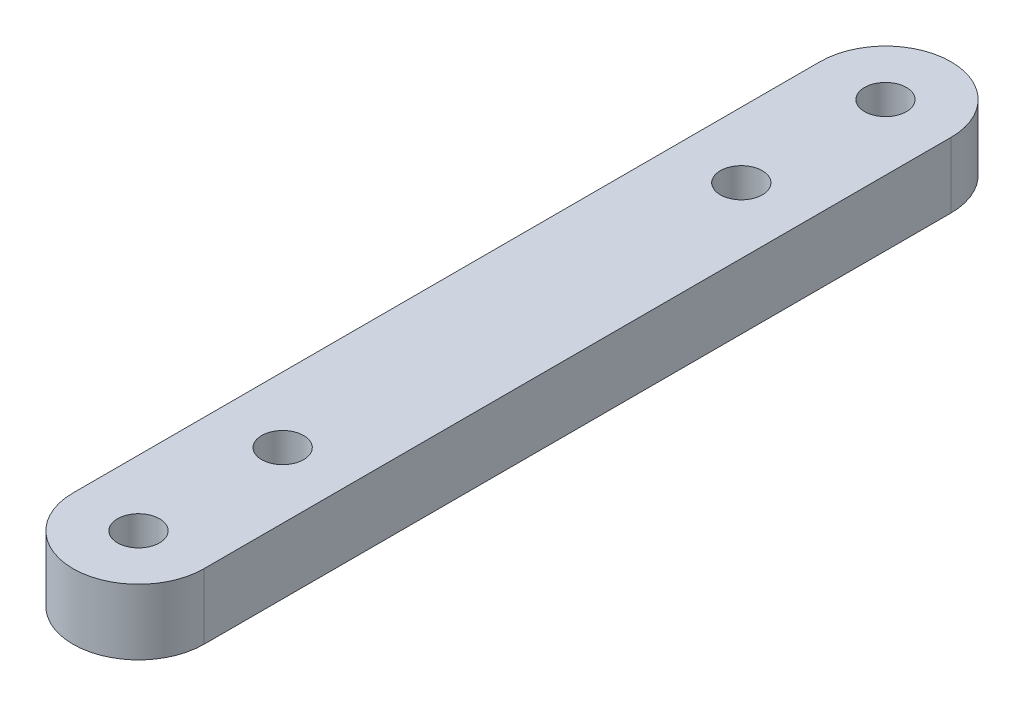
ISO-10303-21;
HEADER;
FILE_DESCRIPTION(('STEP AP214'),'2;1');
FILE_NAME('part.step','',(''),(''),'','','');
FILE_SCHEMA(('AUTOMOTIVE_DESIGN { 1 0 10303 214 1 1 1 1 }'));
ENDSEC;
DATA;
#1=APPLICATION_CONTEXT('core data for automotive mechanical design processes');
#2=APPLICATION_PROTOCOL_DEFINITION('international standard','automotive_design',2000,#1);
#3=PRODUCT_CONTEXT('',#1,'mechanical');
#4=PRODUCT('Part','Part','',(#3));
#5=PRODUCT_RELATED_PRODUCT_CATEGORY('part','',(#4));
#6=PRODUCT_DEFINITION_FORMATION('','',#4);
#7=PRODUCT_DEFINITION_CONTEXT('part definition',#1,'design');
#8=PRODUCT_DEFINITION('design','',#6,#7);
#9=PRODUCT_DEFINITION_SHAPE('','',#8);
#10=(LENGTH_UNIT() NAMED_UNIT(*) SI_UNIT(.MILLI.,.METRE.));
#11=(NAMED_UNIT(*) PLANE_ANGLE_UNIT() SI_UNIT($,.RADIAN.));
#12=(NAMED_UNIT(*) SI_UNIT($,.STERADIAN.) SOLID_ANGLE_UNIT());
#13=UNCERTAINTY_MEASURE_WITH_UNIT(LENGTH_MEASURE(1.E-05),#10,'distance_accuracy_value','');
#14=(GEOMETRIC_REPRESENTATION_CONTEXT(3) GLOBAL_UNCERTAINTY_ASSIGNED_CONTEXT((#13)) GLOBAL_UNIT_ASSIGNED_CONTEXT((#10,
#11,#12)) REPRESENTATION_CONTEXT('',''));
#15=CARTESIAN_POINT('',(0.,0.,0.));
#16=DIRECTION('',(0.,0.,1.));
#17=DIRECTION('',(1.,0.,0.));
#18=AXIS2_PLACEMENT_3D('',#15,#16,#17);
#19=CARTESIAN_POINT('',(1.00000000000001,5.,-17.5));
#20=DIRECTION('',(0.,-1.,0.));
#21=DIRECTION('',(0.,0.,-1.));
#22=AXIS2_PLACEMENT_3D('',#19,#20,#21);
#23=CYLINDRICAL_SURFACE('',#22,1.6);
#24=CARTESIAN_POINT('',(1.00000000000001,5.,-17.5));
#25=DIRECTION('',(0.,1.,0.));
#26=DIRECTION('',(0.,0.,1.));
#27=AXIS2_PLACEMENT_3D('',#24,#25,#26);
#28=CIRCLE('',#27,1.6);
#29=CARTESIAN_POINT('',(1.00000000000001,5.,-15.9));
#30=VERTEX_POINT('',#29);
#31=EDGE_CURVE('E133',#30,#30,#28,.T.);
#32=ORIENTED_EDGE('',*,*,#31,.T.);
#33=EDGE_LOOP('',(#32));
#34=FACE_BOUND('',#33,.T.);
#35=CARTESIAN_POINT('',(1.00000000000001,2.5,-17.5));
#36=DIRECTION('',(0.,-1.,0.));
#37=DIRECTION('',(0.,0.,-1.));
#38=AXIS2_PLACEMENT_3D('',#35,#36,#37);
#39=CIRCLE('',#38,1.6);
#40=CARTESIAN_POINT('',(1.00000000000001,2.5,-19.1));
#41=VERTEX_POINT('',#40);
#42=EDGE_CURVE('E36',#41,#41,#39,.T.);
#43=ORIENTED_EDGE('',*,*,#42,.T.);
#44=EDGE_LOOP('',(#43));
#45=FACE_BOUND('',#44,.T.);
#46=ADVANCED_FACE('F32',(#34,#45),#23,.F.);
#47=CARTESIAN_POINT('',(1.00000000000001,5.,17.5));
#48=DIRECTION('',(0.,-1.,0.));
#49=DIRECTION('',(0.,0.,-1.));
#50=AXIS2_PLACEMENT_3D('',#47,#48,#49);
#51=CYLINDRICAL_SURFACE('',#50,1.6);
#52=CARTESIAN_POINT('',(1.00000000000001,5.,17.5));
#53=DIRECTION('',(0.,1.,0.));
#54=DIRECTION('',(0.,0.,-1.));
#55=AXIS2_PLACEMENT_3D('',#52,#53,#54);
#56=CIRCLE('',#55,1.6);
#57=CARTESIAN_POINT('',(1.00000000000001,5.,15.9));
#58=VERTEX_POINT('',#57);
#59=EDGE_CURVE('E129',#58,#58,#56,.T.);
#60=ORIENTED_EDGE('',*,*,#59,.T.);
#61=EDGE_LOOP('',(#60));
#62=FACE_BOUND('',#61,.T.);
#63=CARTESIAN_POINT('',(1.00000000000001,2.5,17.5));
#64=DIRECTION('',(0.,-1.,0.));
#65=DIRECTION('',(0.,0.,-1.));
#66=AXIS2_PLACEMENT_3D('',#63,#64,#65);
#67=CIRCLE('',#66,1.6);
#68=CARTESIAN_POINT('',(1.00000000000001,2.5,15.9));
#69=VERTEX_POINT('',#68);
#70=EDGE_CURVE('E108',#69,#69,#67,.T.);
#71=ORIENTED_EDGE('',*,*,#70,.T.);
#72=EDGE_LOOP('',(#71));
#73=FACE_BOUND('',#72,.T.);
#74=ADVANCED_FACE('F162',(#62,#73),#51,.F.);
#75=CARTESIAN_POINT('',(1.00000000000001,5.,-28.5));
#76=DIRECTION('',(0.,1.,0.));
#77=DIRECTION('',(0.,0.,1.));
#78=AXIS2_PLACEMENT_3D('',#75,#76,#77);
#79=PLANE('',#78);
#80=ORIENTED_EDGE('',*,*,#59,.F.);
#81=EDGE_LOOP('',(#80));
#82=FACE_BOUND('',#81,.T.);
#83=CARTESIAN_POINT('',(1.00000000000001,5.,-28.5));
#84=DIRECTION('',(0.,1.,0.));
#85=DIRECTION('',(0.,0.,1.));
#86=AXIS2_PLACEMENT_3D('',#83,#84,#85);
#87=CIRCLE('',#86,1.6);
#88=CARTESIAN_POINT('',(1.00000000000001,5.,-26.9));
#89=VERTEX_POINT('',#88);
#90=EDGE_CURVE('E103',#89,#89,#87,.T.);
#91=ORIENTED_EDGE('',*,*,#90,.F.);
#92=EDGE_LOOP('',(#91));
#93=FACE_BOUND('',#92,.T.);
#94=CARTESIAN_POINT('',(1.00000000000001,5.,-28.5));
#95=DIRECTION('',(0.,1.,0.));
#96=DIRECTION('',(0.,0.,1.));
#97=AXIS2_PLACEMENT_3D('',#94,#95,#96);
#98=CIRCLE('',#97,5.00000000000001);
#99=CARTESIAN_POINT('',(6.00000000000001,5.,-28.5));
#100=VERTEX_POINT('',#99);
#101=CARTESIAN_POINT('',(-4.,5.,-28.5));
#102=VERTEX_POINT('',#101);
#103=EDGE_CURVE('E87',#100,#102,#98,.T.);
#104=ORIENTED_EDGE('',*,*,#103,.T.);
#105=DIRECTION('',(0.,0.,1.));
#106=VECTOR('',#105,1.);
#107=CARTESIAN_POINT('',(-4.,5.,-28.5));
#108=LINE('',#107,#106);
#109=CARTESIAN_POINT('',(-3.99999999999999,5.,28.5));
#110=VERTEX_POINT('',#109);
#111=EDGE_CURVE('E81',#102,#110,#108,.T.);
#112=ORIENTED_EDGE('',*,*,#111,.T.);
#113=CARTESIAN_POINT('',(1.00000000000001,5.,28.5));
#114=DIRECTION('',(0.,1.,0.));
#115=DIRECTION('',(0.,0.,-1.));
#116=AXIS2_PLACEMENT_3D('',#113,#114,#115);
#117=CIRCLE('',#116,5.);
#118=CARTESIAN_POINT('',(6.00000000000001,5.,28.5));
#119=VERTEX_POINT('',#118);
#120=EDGE_CURVE('E85',#110,#119,#117,.T.);
#121=ORIENTED_EDGE('',*,*,#120,.T.);
#122=DIRECTION('',(0.,0.,-1.));
#123=VECTOR('',#122,1.);
#124=CARTESIAN_POINT('',(6.00000000000001,5.,-28.5));
#125=LINE('',#124,#123);
#126=EDGE_CURVE('E51',#119,#100,#125,.T.);
#127=ORIENTED_EDGE('',*,*,#126,.T.);
#128=EDGE_LOOP('',(#104,#112,#121,#127));
#129=FACE_BOUND('',#128,.T.);
#130=ORIENTED_EDGE('',*,*,#31,.F.);
#131=EDGE_LOOP('',(#130));
#132=FACE_BOUND('',#131,.T.);
#133=CARTESIAN_POINT('',(1.00000000000001,5.,28.5));
#134=DIRECTION('',(0.,1.,0.));
#135=DIRECTION('',(0.,0.,-1.));
#136=AXIS2_PLACEMENT_3D('',#133,#134,#135);
#137=CIRCLE('',#136,1.6);
#138=CARTESIAN_POINT('',(1.00000000000001,5.,26.9));
#139=VERTEX_POINT('',#138);
#140=EDGE_CURVE('E115',#139,#139,#137,.T.);
#141=ORIENTED_EDGE('',*,*,#140,.F.);
#142=EDGE_LOOP('',(#141));
#143=FACE_BOUND('',#142,.T.);
#144=ADVANCED_FACE('F82',(#82,#93,#129,#132,#143),#79,.T.);
#145=CARTESIAN_POINT('',(1.00000000000001,0.,-28.5));
#146=DIRECTION('',(0.,1.,0.));
#147=DIRECTION('',(0.,0.,1.));
#148=AXIS2_PLACEMENT_3D('',#145,#146,#147);
#149=PLANE('',#148);
#150=CARTESIAN_POINT('',(1.00000000000001,0.,-17.5));
#151=DIRECTION('',(0.,-1.,0.));
#152=DIRECTION('',(0.,0.,-1.));
#153=AXIS2_PLACEMENT_3D('',#150,#151,#152);
#154=CIRCLE('',#153,3.);
#155=CARTESIAN_POINT('',(1.00000000000001,0.,-20.5));
#156=VERTEX_POINT('',#155);
#157=EDGE_CURVE('E125',#156,#156,#154,.T.);
#158=ORIENTED_EDGE('',*,*,#157,.F.);
#159=EDGE_LOOP('',(#158));
#160=FACE_BOUND('',#159,.T.);
#161=CARTESIAN_POINT('',(1.00000000000001,0.,17.5));
#162=DIRECTION('',(0.,-1.,0.));
#163=DIRECTION('',(0.,0.,-1.));
#164=AXIS2_PLACEMENT_3D('',#161,#162,#163);
#165=CIRCLE('',#164,3.);
#166=CARTESIAN_POINT('',(1.00000000000001,0.,14.5));
#167=VERTEX_POINT('',#166);
#168=EDGE_CURVE('E118',#167,#167,#165,.T.);
#169=ORIENTED_EDGE('',*,*,#168,.F.);
#170=EDGE_LOOP('',(#169));
#171=FACE_BOUND('',#170,.T.);
#172=CARTESIAN_POINT('',(1.00000000000001,0.,-28.5));
#173=DIRECTION('',(0.,1.,0.));
#174=DIRECTION('',(0.,0.,1.));
#175=AXIS2_PLACEMENT_3D('',#172,#173,#174);
#176=CIRCLE('',#175,1.6);
#177=CARTESIAN_POINT('',(1.00000000000001,0.,-26.9));
#178=VERTEX_POINT('',#177);
#179=EDGE_CURVE('E136',#178,#178,#176,.T.);
#180=ORIENTED_EDGE('',*,*,#179,.T.);
#181=EDGE_LOOP('',(#180));
#182=FACE_BOUND('',#181,.T.);
#183=CARTESIAN_POINT('',(1.00000000000001,0.,-28.5));
#184=DIRECTION('',(0.,1.,0.));
#185=DIRECTION('',(0.,0.,1.));
#186=AXIS2_PLACEMENT_3D('',#183,#184,#185);
#187=CIRCLE('',#186,5.00000000000001);
#188=CARTESIAN_POINT('',(6.00000000000001,0.,-28.5));
#189=VERTEX_POINT('',#188);
#190=CARTESIAN_POINT('',(-4.,0.,-28.5));
#191=VERTEX_POINT('',#190);
#192=EDGE_CURVE('E100',#189,#191,#187,.T.);
#193=ORIENTED_EDGE('',*,*,#192,.F.);
#194=DIRECTION('',(0.,0.,-1.));
#195=VECTOR('',#194,1.);
#196=CARTESIAN_POINT('',(6.00000000000001,0.,-28.5));
#197=LINE('',#196,#195);
#198=CARTESIAN_POINT('',(6.00000000000001,0.,28.5));
#199=VERTEX_POINT('',#198);
#200=EDGE_CURVE('E74',#199,#189,#197,.T.);
#201=ORIENTED_EDGE('',*,*,#200,.F.);
#202=CARTESIAN_POINT('',(1.00000000000001,0.,28.5));
#203=DIRECTION('',(0.,1.,0.));
#204=DIRECTION('',(0.,0.,-1.));
#205=AXIS2_PLACEMENT_3D('',#202,#203,#204);
#206=CIRCLE('',#205,5.);
#207=CARTESIAN_POINT('',(-3.99999999999999,0.,28.5));
#208=VERTEX_POINT('',#207);
#209=EDGE_CURVE('E68',#208,#199,#206,.T.);
#210=ORIENTED_EDGE('',*,*,#209,.F.);
#211=DIRECTION('',(0.,0.,1.));
#212=VECTOR('',#211,1.);
#213=CARTESIAN_POINT('',(-4.,0.,-28.5));
#214=LINE('',#213,#212);
#215=EDGE_CURVE('E91',#191,#208,#214,.T.);
#216=ORIENTED_EDGE('',*,*,#215,.F.);
#217=EDGE_LOOP('',(#193,#201,#210,#216));
#218=FACE_BOUND('',#217,.T.);
#219=CARTESIAN_POINT('',(1.00000000000001,0.,28.5));
#220=DIRECTION('',(0.,1.,0.));
#221=DIRECTION('',(0.,0.,-1.));
#222=AXIS2_PLACEMENT_3D('',#219,#220,#221);
#223=CIRCLE('',#222,1.6);
#224=CARTESIAN_POINT('',(1.00000000000001,0.,26.9));
#225=VERTEX_POINT('',#224);
#226=EDGE_CURVE('E110',#225,#225,#223,.T.);
#227=ORIENTED_EDGE('',*,*,#226,.T.);
#228=EDGE_LOOP('',(#227));
#229=FACE_BOUND('',#228,.T.);
#230=ADVANCED_FACE('F142',(#160,#171,#182,#218,#229),#149,.F.);
#231=CARTESIAN_POINT('',(1.00000000000001,5.,-28.5));
#232=DIRECTION('',(0.,-1.,0.));
#233=DIRECTION('',(0.,0.,-1.));
#234=AXIS2_PLACEMENT_3D('',#231,#232,#233);
#235=CYLINDRICAL_SURFACE('',#234,5.00000000000001);
#236=ORIENTED_EDGE('',*,*,#192,.T.);
#237=DIRECTION('',(0.,-1.,0.));
#238=VECTOR('',#237,1.);
#239=CARTESIAN_POINT('',(-4.,5.,-28.5));
#240=LINE('',#239,#238);
#241=EDGE_CURVE('E11',#102,#191,#240,.T.);
#242=ORIENTED_EDGE('',*,*,#241,.F.);
#243=ORIENTED_EDGE('',*,*,#103,.F.);
#244=DIRECTION('',(0.,-1.,0.));
#245=VECTOR('',#244,1.);
#246=CARTESIAN_POINT('',(6.00000000000001,5.,-28.5));
#247=LINE('',#246,#245);
#248=EDGE_CURVE('E96',#100,#189,#247,.T.);
#249=ORIENTED_EDGE('',*,*,#248,.T.);
#250=EDGE_LOOP('',(#236,#242,#243,#249));
#251=FACE_BOUND('',#250,.T.);
#252=ADVANCED_FACE('F34',(#251),#235,.T.);
#253=CARTESIAN_POINT('',(-4.,5.,-28.5));
#254=DIRECTION('',(1.,0.,0.));
#255=DIRECTION('',(0.,0.,-1.));
#256=AXIS2_PLACEMENT_3D('',#253,#254,#255);
#257=PLANE('',#256);
#258=ORIENTED_EDGE('',*,*,#215,.T.);
#259=DIRECTION('',(0.,-1.,0.));
#260=VECTOR('',#259,1.);
#261=CARTESIAN_POINT('',(-3.99999999999999,5.,28.5));
#262=LINE('',#261,#260);
#263=EDGE_CURVE('E42',#110,#208,#262,.T.);
#264=ORIENTED_EDGE('',*,*,#263,.F.);
#265=ORIENTED_EDGE('',*,*,#111,.F.);
#266=ORIENTED_EDGE('',*,*,#241,.T.);
#267=EDGE_LOOP('',(#258,#264,#265,#266));
#268=FACE_BOUND('',#267,.T.);
#269=ADVANCED_FACE('F90',(#268),#257,.F.);
#270=CARTESIAN_POINT('',(1.00000000000001,5.,28.5));
#271=DIRECTION('',(0.,-1.,0.));
#272=DIRECTION('',(0.,0.,-1.));
#273=AXIS2_PLACEMENT_3D('',#270,#271,#272);
#274=CYLINDRICAL_SURFACE('',#273,5.);
#275=ORIENTED_EDGE('',*,*,#209,.T.);
#276=DIRECTION('',(0.,-1.,0.));
#277=VECTOR('',#276,1.);
#278=CARTESIAN_POINT('',(6.00000000000001,5.,28.5));
#279=LINE('',#278,#277);
#280=EDGE_CURVE('E92',#119,#199,#279,.T.);
#281=ORIENTED_EDGE('',*,*,#280,.F.);
#282=ORIENTED_EDGE('',*,*,#120,.F.);
#283=ORIENTED_EDGE('',*,*,#263,.T.);
#284=EDGE_LOOP('',(#275,#281,#282,#283));
#285=FACE_BOUND('',#284,.T.);
#286=ADVANCED_FACE('F94',(#285),#274,.T.);
#287=CARTESIAN_POINT('',(6.00000000000001,5.,-28.5));
#288=DIRECTION('',(-1.,0.,0.));
#289=DIRECTION('',(0.,0.,1.));
#290=AXIS2_PLACEMENT_3D('',#287,#288,#289);
#291=PLANE('',#290);
#292=ORIENTED_EDGE('',*,*,#200,.T.);
#293=ORIENTED_EDGE('',*,*,#248,.F.);
#294=ORIENTED_EDGE('',*,*,#126,.F.);
#295=ORIENTED_EDGE('',*,*,#280,.T.);
#296=EDGE_LOOP('',(#292,#293,#294,#295));
#297=FACE_BOUND('',#296,.T.);
#298=ADVANCED_FACE('F148',(#297),#291,.F.);
#299=CARTESIAN_POINT('',(1.00000000000001,5.,-28.5));
#300=DIRECTION('',(0.,-1.,0.));
#301=DIRECTION('',(0.,0.,-1.));
#302=AXIS2_PLACEMENT_3D('',#299,#300,#301);
#303=CYLINDRICAL_SURFACE('',#302,1.6);
#304=ORIENTED_EDGE('',*,*,#90,.T.);
#305=EDGE_LOOP('',(#304));
#306=FACE_BOUND('',#305,.T.);
#307=ORIENTED_EDGE('',*,*,#179,.F.);
#308=EDGE_LOOP('',(#307));
#309=FACE_BOUND('',#308,.T.);
#310=ADVANCED_FACE('F145',(#306,#309),#303,.F.);
#311=CARTESIAN_POINT('',(1.00000000000001,5.,28.5));
#312=DIRECTION('',(0.,-1.,0.));
#313=DIRECTION('',(0.,0.,-1.));
#314=AXIS2_PLACEMENT_3D('',#311,#312,#313);
#315=CYLINDRICAL_SURFACE('',#314,1.6);
#316=ORIENTED_EDGE('',*,*,#140,.T.);
#317=EDGE_LOOP('',(#316));
#318=FACE_BOUND('',#317,.T.);
#319=ORIENTED_EDGE('',*,*,#226,.F.);
#320=EDGE_LOOP('',(#319));
#321=FACE_BOUND('',#320,.T.);
#322=ADVANCED_FACE('F147',(#318,#321),#315,.F.);
#323=CARTESIAN_POINT('',(1.00000000000001,2.5,17.5));
#324=DIRECTION('',(0.,-1.,0.));
#325=DIRECTION('',(0.,0.,-1.));
#326=AXIS2_PLACEMENT_3D('',#323,#324,#325);
#327=CYLINDRICAL_SURFACE('',#326,3.);
#328=CARTESIAN_POINT('',(1.00000000000001,2.5,17.5));
#329=DIRECTION('',(0.,-1.,0.));
#330=DIRECTION('',(0.,0.,-1.));
#331=AXIS2_PLACEMENT_3D('',#328,#329,#330);
#332=CIRCLE('',#331,3.);
#333=CARTESIAN_POINT('',(1.00000000000001,2.5,14.5));
#334=VERTEX_POINT('',#333);
#335=EDGE_CURVE('E111',#334,#334,#332,.T.);
#336=ORIENTED_EDGE('',*,*,#335,.F.);
#337=EDGE_LOOP('',(#336));
#338=FACE_BOUND('',#337,.T.);
#339=ORIENTED_EDGE('',*,*,#168,.T.);
#340=EDGE_LOOP('',(#339));
#341=FACE_BOUND('',#340,.T.);
#342=ADVANCED_FACE('F155',(#338,#341),#327,.F.);
#343=CARTESIAN_POINT('',(1.00000000000001,2.5,17.5));
#344=DIRECTION('',(0.,-1.,0.));
#345=DIRECTION('',(0.,0.,-1.));
#346=AXIS2_PLACEMENT_3D('',#343,#344,#345);
#347=PLANE('',#346);
#348=ORIENTED_EDGE('',*,*,#70,.F.);
#349=EDGE_LOOP('',(#348));
#350=FACE_BOUND('',#349,.T.);
#351=ORIENTED_EDGE('',*,*,#335,.T.);
#352=EDGE_LOOP('',(#351));
#353=FACE_BOUND('',#352,.T.);
#354=ADVANCED_FACE('F173',(#350,#353),#347,.T.);
#355=CARTESIAN_POINT('',(1.00000000000001,2.5,-17.5));
#356=DIRECTION('',(0.,-1.,0.));
#357=DIRECTION('',(0.,0.,-1.));
#358=AXIS2_PLACEMENT_3D('',#355,#356,#357);
#359=CYLINDRICAL_SURFACE('',#358,3.);
#360=CARTESIAN_POINT('',(1.00000000000001,2.5,-17.5));
#361=DIRECTION('',(0.,-1.,0.));
#362=DIRECTION('',(0.,0.,-1.));
#363=AXIS2_PLACEMENT_3D('',#360,#361,#362);
#364=CIRCLE('',#363,3.);
#365=CARTESIAN_POINT('',(1.00000000000001,2.5,-20.5));
#366=VERTEX_POINT('',#365);
#367=EDGE_CURVE('E192',#366,#366,#364,.T.);
#368=ORIENTED_EDGE('',*,*,#367,.F.);
#369=EDGE_LOOP('',(#368));
#370=FACE_BOUND('',#369,.T.);
#371=ORIENTED_EDGE('',*,*,#157,.T.);
#372=EDGE_LOOP('',(#371));
#373=FACE_BOUND('',#372,.T.);
#374=ADVANCED_FACE('F177',(#370,#373),#359,.F.);
#375=CARTESIAN_POINT('',(1.00000000000001,2.5,-17.5));
#376=DIRECTION('',(0.,-1.,0.));
#377=DIRECTION('',(0.,0.,-1.));
#378=AXIS2_PLACEMENT_3D('',#375,#376,#377);
#379=PLANE('',#378);
#380=ORIENTED_EDGE('',*,*,#42,.F.);
#381=EDGE_LOOP('',(#380));
#382=FACE_BOUND('',#381,.T.);
#383=ORIENTED_EDGE('',*,*,#367,.T.);
#384=EDGE_LOOP('',(#383));
#385=FACE_BOUND('',#384,.T.);
#386=ADVANCED_FACE('F181',(#382,#385),#379,.T.);
#387=CLOSED_SHELL('',(#46,#74,#144,#230,#252,#269,#286,#298,#310,#322,#342,#354,#374,#386));
#388=MANIFOLD_SOLID_BREP('B2',#387);
#389=ADVANCED_BREP_SHAPE_REPRESENTATION('',(#18,#388),#14);
#390=SHAPE_DEFINITION_REPRESENTATION(#9,#389);
ENDSEC;
END-ISO-10303-21;
